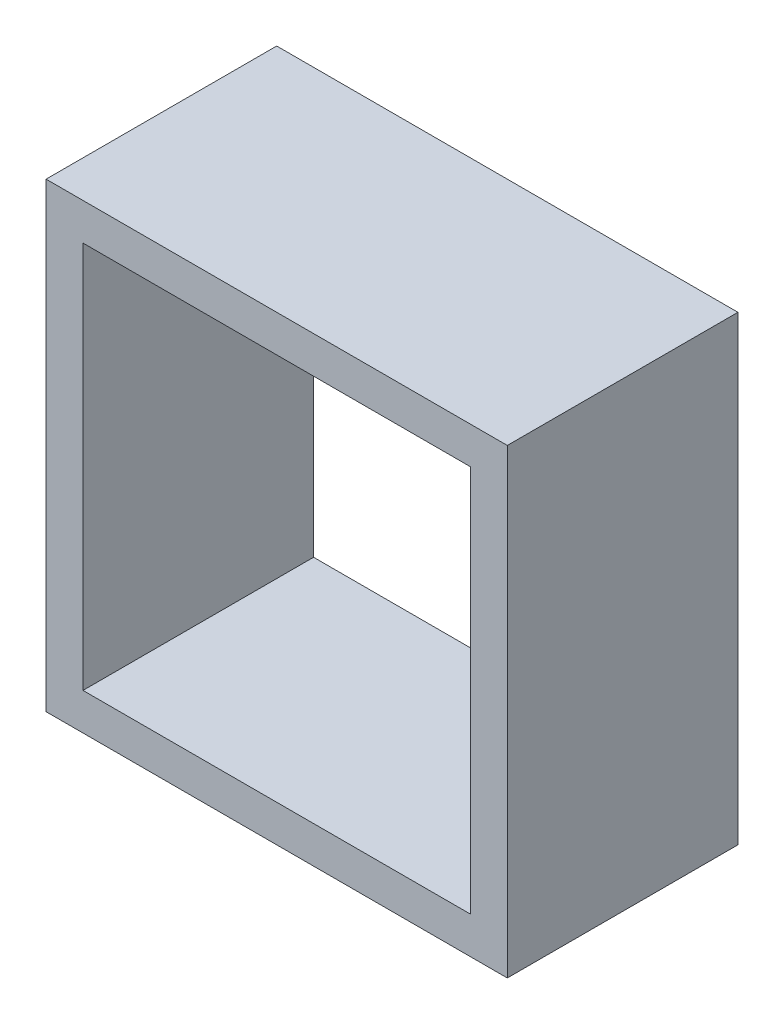
ISO-10303-21;
HEADER;
FILE_DESCRIPTION(('STEP AP214'),'2;1');
FILE_NAME('part.step','',(''),(''),'','','');
FILE_SCHEMA(('AUTOMOTIVE_DESIGN { 1 0 10303 214 1 1 1 1 }'));
ENDSEC;
DATA;
#1=APPLICATION_CONTEXT('core data for automotive mechanical design processes');
#2=APPLICATION_PROTOCOL_DEFINITION('international standard','automotive_design',2000,#1);
#3=PRODUCT_CONTEXT('',#1,'mechanical');
#4=PRODUCT('Part','Part','',(#3));
#5=PRODUCT_RELATED_PRODUCT_CATEGORY('part','',(#4));
#6=PRODUCT_DEFINITION_FORMATION('','',#4);
#7=PRODUCT_DEFINITION_CONTEXT('part definition',#1,'design');
#8=PRODUCT_DEFINITION('design','',#6,#7);
#9=PRODUCT_DEFINITION_SHAPE('','',#8);
#10=(LENGTH_UNIT() NAMED_UNIT(*) SI_UNIT(.MILLI.,.METRE.));
#11=(NAMED_UNIT(*) PLANE_ANGLE_UNIT() SI_UNIT($,.RADIAN.));
#12=(NAMED_UNIT(*) SI_UNIT($,.STERADIAN.) SOLID_ANGLE_UNIT());
#13=UNCERTAINTY_MEASURE_WITH_UNIT(LENGTH_MEASURE(1.E-05),#10,'distance_accuracy_value','');
#14=(GEOMETRIC_REPRESENTATION_CONTEXT(3) GLOBAL_UNCERTAINTY_ASSIGNED_CONTEXT((#13)) GLOBAL_UNIT_ASSIGNED_CONTEXT((#10,
#11,#12)) REPRESENTATION_CONTEXT('',''));
#15=CARTESIAN_POINT('',(0.,0.,0.));
#16=DIRECTION('',(0.,0.,1.));
#17=DIRECTION('',(1.,0.,0.));
#18=AXIS2_PLACEMENT_3D('',#15,#16,#17);
#19=CARTESIAN_POINT('',(0.,0.,5.));
#20=DIRECTION('',(0.,0.,-1.));
#21=DIRECTION('',(-1.,0.,0.));
#22=AXIS2_PLACEMENT_3D('',#19,#20,#21);
#23=PLANE('',#22);
#24=DIRECTION('',(0.,1.,0.));
#25=VECTOR('',#24,1.);
#26=CARTESIAN_POINT('',(5.,-5.,5.));
#27=LINE('',#26,#25);
#28=CARTESIAN_POINT('',(5.,-5.,5.));
#29=VERTEX_POINT('',#28);
#30=CARTESIAN_POINT('',(5.,5.,5.));
#31=VERTEX_POINT('',#30);
#32=EDGE_CURVE('E134',#29,#31,#27,.T.);
#33=ORIENTED_EDGE('',*,*,#32,.T.);
#34=DIRECTION('',(-1.,0.,0.));
#35=VECTOR('',#34,1.);
#36=CARTESIAN_POINT('',(-5.,5.,5.));
#37=LINE('',#36,#35);
#38=CARTESIAN_POINT('',(-5.,5.,5.));
#39=VERTEX_POINT('',#38);
#40=EDGE_CURVE('E137',#31,#39,#37,.T.);
#41=ORIENTED_EDGE('',*,*,#40,.T.);
#42=DIRECTION('',(0.,-1.,0.));
#43=VECTOR('',#42,1.);
#44=CARTESIAN_POINT('',(-5.,-5.,5.));
#45=LINE('',#44,#43);
#46=CARTESIAN_POINT('',(-5.,-5.,5.));
#47=VERTEX_POINT('',#46);
#48=EDGE_CURVE('E140',#39,#47,#45,.T.);
#49=ORIENTED_EDGE('',*,*,#48,.T.);
#50=DIRECTION('',(1.,0.,0.));
#51=VECTOR('',#50,1.);
#52=CARTESIAN_POINT('',(-5.,-5.,5.));
#53=LINE('',#52,#51);
#54=EDGE_CURVE('E142',#47,#29,#53,.T.);
#55=ORIENTED_EDGE('',*,*,#54,.T.);
#56=EDGE_LOOP('',(#33,#41,#49,#55));
#57=FACE_BOUND('',#56,.T.);
#58=DIRECTION('',(0.,-1.,0.));
#59=VECTOR('',#58,1.);
#60=CARTESIAN_POINT('',(-4.2,-4.2,5.));
#61=LINE('',#60,#59);
#62=CARTESIAN_POINT('',(-4.2,4.2,5.));
#63=VERTEX_POINT('',#62);
#64=CARTESIAN_POINT('',(-4.2,-4.2,5.));
#65=VERTEX_POINT('',#64);
#66=EDGE_CURVE('E98',#63,#65,#61,.T.);
#67=ORIENTED_EDGE('',*,*,#66,.F.);
#68=DIRECTION('',(-1.,0.,0.));
#69=VECTOR('',#68,1.);
#70=CARTESIAN_POINT('',(-4.2,4.2,5.));
#71=LINE('',#70,#69);
#72=CARTESIAN_POINT('',(4.2,4.2,5.));
#73=VERTEX_POINT('',#72);
#74=EDGE_CURVE('E120',#73,#63,#71,.T.);
#75=ORIENTED_EDGE('',*,*,#74,.F.);
#76=DIRECTION('',(0.,1.,0.));
#77=VECTOR('',#76,1.);
#78=CARTESIAN_POINT('',(4.2,-4.2,5.));
#79=LINE('',#78,#77);
#80=CARTESIAN_POINT('',(4.2,-4.2,5.));
#81=VERTEX_POINT('',#80);
#82=EDGE_CURVE('E118',#81,#73,#79,.T.);
#83=ORIENTED_EDGE('',*,*,#82,.F.);
#84=DIRECTION('',(1.,0.,0.));
#85=VECTOR('',#84,1.);
#86=CARTESIAN_POINT('',(-4.2,-4.2,5.));
#87=LINE('',#86,#85);
#88=EDGE_CURVE('E106',#65,#81,#87,.T.);
#89=ORIENTED_EDGE('',*,*,#88,.F.);
#90=EDGE_LOOP('',(#67,#75,#83,#89));
#91=FACE_BOUND('',#90,.T.);
#92=ADVANCED_FACE('F33',(#57,#91),#23,.F.);
#93=CARTESIAN_POINT('',(0.,0.,0.));
#94=DIRECTION('',(0.,0.,-1.));
#95=DIRECTION('',(-1.,0.,0.));
#96=AXIS2_PLACEMENT_3D('',#93,#94,#95);
#97=PLANE('',#96);
#98=DIRECTION('',(0.,1.,0.));
#99=VECTOR('',#98,1.);
#100=CARTESIAN_POINT('',(5.,-5.,0.));
#101=LINE('',#100,#99);
#102=CARTESIAN_POINT('',(5.,-5.,0.));
#103=VERTEX_POINT('',#102);
#104=CARTESIAN_POINT('',(5.,5.,0.));
#105=VERTEX_POINT('',#104);
#106=EDGE_CURVE('E114',#103,#105,#101,.T.);
#107=ORIENTED_EDGE('',*,*,#106,.F.);
#108=DIRECTION('',(1.,0.,0.));
#109=VECTOR('',#108,1.);
#110=CARTESIAN_POINT('',(-5.,-5.,0.));
#111=LINE('',#110,#109);
#112=CARTESIAN_POINT('',(-5.,-5.,0.));
#113=VERTEX_POINT('',#112);
#114=EDGE_CURVE('E138',#113,#103,#111,.T.);
#115=ORIENTED_EDGE('',*,*,#114,.F.);
#116=DIRECTION('',(0.,-1.,0.));
#117=VECTOR('',#116,1.);
#118=CARTESIAN_POINT('',(-5.,-5.,0.));
#119=LINE('',#118,#117);
#120=CARTESIAN_POINT('',(-5.,5.,0.));
#121=VERTEX_POINT('',#120);
#122=EDGE_CURVE('E149',#121,#113,#119,.T.);
#123=ORIENTED_EDGE('',*,*,#122,.F.);
#124=DIRECTION('',(-1.,0.,0.));
#125=VECTOR('',#124,1.);
#126=CARTESIAN_POINT('',(-5.,5.,0.));
#127=LINE('',#126,#125);
#128=EDGE_CURVE('E147',#105,#121,#127,.T.);
#129=ORIENTED_EDGE('',*,*,#128,.F.);
#130=EDGE_LOOP('',(#107,#115,#123,#129));
#131=FACE_BOUND('',#130,.T.);
#132=DIRECTION('',(-1.,0.,0.));
#133=VECTOR('',#132,1.);
#134=CARTESIAN_POINT('',(-4.2,4.2,0.));
#135=LINE('',#134,#133);
#136=CARTESIAN_POINT('',(4.2,4.2,0.));
#137=VERTEX_POINT('',#136);
#138=CARTESIAN_POINT('',(-4.2,4.2,0.));
#139=VERTEX_POINT('',#138);
#140=EDGE_CURVE('E107',#137,#139,#135,.T.);
#141=ORIENTED_EDGE('',*,*,#140,.T.);
#142=DIRECTION('',(0.,-1.,0.));
#143=VECTOR('',#142,1.);
#144=CARTESIAN_POINT('',(-4.2,-4.2,0.));
#145=LINE('',#144,#143);
#146=CARTESIAN_POINT('',(-4.2,-4.2,0.));
#147=VERTEX_POINT('',#146);
#148=EDGE_CURVE('E56',#139,#147,#145,.T.);
#149=ORIENTED_EDGE('',*,*,#148,.T.);
#150=DIRECTION('',(1.,0.,0.));
#151=VECTOR('',#150,1.);
#152=CARTESIAN_POINT('',(-4.2,-4.2,0.));
#153=LINE('',#152,#151);
#154=CARTESIAN_POINT('',(4.2,-4.2,0.));
#155=VERTEX_POINT('',#154);
#156=EDGE_CURVE('E113',#147,#155,#153,.T.);
#157=ORIENTED_EDGE('',*,*,#156,.T.);
#158=DIRECTION('',(0.,1.,0.));
#159=VECTOR('',#158,1.);
#160=CARTESIAN_POINT('',(4.2,-4.2,0.));
#161=LINE('',#160,#159);
#162=EDGE_CURVE('E126',#155,#137,#161,.T.);
#163=ORIENTED_EDGE('',*,*,#162,.T.);
#164=EDGE_LOOP('',(#141,#149,#157,#163));
#165=FACE_BOUND('',#164,.T.);
#166=ADVANCED_FACE('F167',(#131,#165),#97,.T.);
#167=CARTESIAN_POINT('',(5.,-5.,5.));
#168=DIRECTION('',(-1.,0.,0.));
#169=DIRECTION('',(0.,0.,1.));
#170=AXIS2_PLACEMENT_3D('',#167,#168,#169);
#171=PLANE('',#170);
#172=ORIENTED_EDGE('',*,*,#106,.T.);
#173=DIRECTION('',(0.,0.,-1.));
#174=VECTOR('',#173,1.);
#175=CARTESIAN_POINT('',(5.,5.,5.));
#176=LINE('',#175,#174);
#177=EDGE_CURVE('E11',#31,#105,#176,.T.);
#178=ORIENTED_EDGE('',*,*,#177,.F.);
#179=ORIENTED_EDGE('',*,*,#32,.F.);
#180=DIRECTION('',(0.,0.,-1.));
#181=VECTOR('',#180,1.);
#182=CARTESIAN_POINT('',(5.,-5.,5.));
#183=LINE('',#182,#181);
#184=EDGE_CURVE('E144',#29,#103,#183,.T.);
#185=ORIENTED_EDGE('',*,*,#184,.T.);
#186=EDGE_LOOP('',(#172,#178,#179,#185));
#187=FACE_BOUND('',#186,.T.);
#188=ADVANCED_FACE('F35',(#187),#171,.F.);
#189=CARTESIAN_POINT('',(-5.,5.,5.));
#190=DIRECTION('',(0.,-1.,0.));
#191=DIRECTION('',(0.,0.,-1.));
#192=AXIS2_PLACEMENT_3D('',#189,#190,#191);
#193=PLANE('',#192);
#194=ORIENTED_EDGE('',*,*,#128,.T.);
#195=DIRECTION('',(0.,0.,-1.));
#196=VECTOR('',#195,1.);
#197=CARTESIAN_POINT('',(-5.,5.,5.));
#198=LINE('',#197,#196);
#199=EDGE_CURVE('E41',#39,#121,#198,.T.);
#200=ORIENTED_EDGE('',*,*,#199,.F.);
#201=ORIENTED_EDGE('',*,*,#40,.F.);
#202=ORIENTED_EDGE('',*,*,#177,.T.);
#203=EDGE_LOOP('',(#194,#200,#201,#202));
#204=FACE_BOUND('',#203,.T.);
#205=ADVANCED_FACE('F177',(#204),#193,.F.);
#206=CARTESIAN_POINT('',(-5.,-5.,5.));
#207=DIRECTION('',(1.,0.,0.));
#208=DIRECTION('',(0.,0.,-1.));
#209=AXIS2_PLACEMENT_3D('',#206,#207,#208);
#210=PLANE('',#209);
#211=ORIENTED_EDGE('',*,*,#122,.T.);
#212=DIRECTION('',(0.,0.,-1.));
#213=VECTOR('',#212,1.);
#214=CARTESIAN_POINT('',(-5.,-5.,5.));
#215=LINE('',#214,#213);
#216=EDGE_CURVE('E154',#47,#113,#215,.T.);
#217=ORIENTED_EDGE('',*,*,#216,.F.);
#218=ORIENTED_EDGE('',*,*,#48,.F.);
#219=ORIENTED_EDGE('',*,*,#199,.T.);
#220=EDGE_LOOP('',(#211,#217,#218,#219));
#221=FACE_BOUND('',#220,.T.);
#222=ADVANCED_FACE('F161',(#221),#210,.F.);
#223=CARTESIAN_POINT('',(-5.,-5.,5.));
#224=DIRECTION('',(0.,1.,0.));
#225=DIRECTION('',(0.,0.,1.));
#226=AXIS2_PLACEMENT_3D('',#223,#224,#225);
#227=PLANE('',#226);
#228=ORIENTED_EDGE('',*,*,#114,.T.);
#229=ORIENTED_EDGE('',*,*,#184,.F.);
#230=ORIENTED_EDGE('',*,*,#54,.F.);
#231=ORIENTED_EDGE('',*,*,#216,.T.);
#232=EDGE_LOOP('',(#228,#229,#230,#231));
#233=FACE_BOUND('',#232,.T.);
#234=ADVANCED_FACE('F171',(#233),#227,.F.);
#235=CARTESIAN_POINT('',(-4.2,-4.2,5.));
#236=DIRECTION('',(1.,0.,0.));
#237=DIRECTION('',(0.,0.,-1.));
#238=AXIS2_PLACEMENT_3D('',#235,#236,#237);
#239=PLANE('',#238);
#240=ORIENTED_EDGE('',*,*,#148,.F.);
#241=DIRECTION('',(0.,0.,-1.));
#242=VECTOR('',#241,1.);
#243=CARTESIAN_POINT('',(-4.2,4.2,5.));
#244=LINE('',#243,#242);
#245=EDGE_CURVE('E102',#63,#139,#244,.T.);
#246=ORIENTED_EDGE('',*,*,#245,.F.);
#247=ORIENTED_EDGE('',*,*,#66,.T.);
#248=DIRECTION('',(0.,0.,-1.));
#249=VECTOR('',#248,1.);
#250=CARTESIAN_POINT('',(-4.2,-4.2,5.));
#251=LINE('',#250,#249);
#252=EDGE_CURVE('E101',#65,#147,#251,.T.);
#253=ORIENTED_EDGE('',*,*,#252,.T.);
#254=EDGE_LOOP('',(#240,#246,#247,#253));
#255=FACE_BOUND('',#254,.T.);
#256=ADVANCED_FACE('F100',(#255),#239,.T.);
#257=CARTESIAN_POINT('',(-4.2,-4.2,5.));
#258=DIRECTION('',(0.,1.,0.));
#259=DIRECTION('',(0.,0.,1.));
#260=AXIS2_PLACEMENT_3D('',#257,#258,#259);
#261=PLANE('',#260);
#262=ORIENTED_EDGE('',*,*,#156,.F.);
#263=ORIENTED_EDGE('',*,*,#252,.F.);
#264=ORIENTED_EDGE('',*,*,#88,.T.);
#265=DIRECTION('',(0.,0.,-1.));
#266=VECTOR('',#265,1.);
#267=CARTESIAN_POINT('',(4.2,-4.2,5.));
#268=LINE('',#267,#266);
#269=EDGE_CURVE('E115',#81,#155,#268,.T.);
#270=ORIENTED_EDGE('',*,*,#269,.T.);
#271=EDGE_LOOP('',(#262,#263,#264,#270));
#272=FACE_BOUND('',#271,.T.);
#273=ADVANCED_FACE('F110',(#272),#261,.T.);
#274=CARTESIAN_POINT('',(4.2,-4.2,5.));
#275=DIRECTION('',(-1.,0.,0.));
#276=DIRECTION('',(0.,-1.,0.));
#277=AXIS2_PLACEMENT_3D('',#274,#275,#276);
#278=PLANE('',#277);
#279=ORIENTED_EDGE('',*,*,#162,.F.);
#280=ORIENTED_EDGE('',*,*,#269,.F.);
#281=ORIENTED_EDGE('',*,*,#82,.T.);
#282=DIRECTION('',(0.,0.,-1.));
#283=VECTOR('',#282,1.);
#284=CARTESIAN_POINT('',(4.2,4.2,5.));
#285=LINE('',#284,#283);
#286=EDGE_CURVE('E48',#73,#137,#285,.T.);
#287=ORIENTED_EDGE('',*,*,#286,.T.);
#288=EDGE_LOOP('',(#279,#280,#281,#287));
#289=FACE_BOUND('',#288,.T.);
#290=ADVANCED_FACE('F200',(#289),#278,.T.);
#291=CARTESIAN_POINT('',(-4.2,4.2,5.));
#292=DIRECTION('',(0.,-1.,0.));
#293=DIRECTION('',(1.,0.,0.));
#294=AXIS2_PLACEMENT_3D('',#291,#292,#293);
#295=PLANE('',#294);
#296=ORIENTED_EDGE('',*,*,#140,.F.);
#297=ORIENTED_EDGE('',*,*,#286,.F.);
#298=ORIENTED_EDGE('',*,*,#74,.T.);
#299=ORIENTED_EDGE('',*,*,#245,.T.);
#300=EDGE_LOOP('',(#296,#297,#298,#299));
#301=FACE_BOUND('',#300,.T.);
#302=ADVANCED_FACE('F204',(#301),#295,.T.);
#303=CLOSED_SHELL('',(#92,#166,#188,#205,#222,#234,#256,#273,#290,#302));
#304=MANIFOLD_SOLID_BREP('B2',#303);
#305=ADVANCED_BREP_SHAPE_REPRESENTATION('',(#18,#304),#14);
#306=SHAPE_DEFINITION_REPRESENTATION(#9,#305);
ENDSEC;
END-ISO-10303-21;
